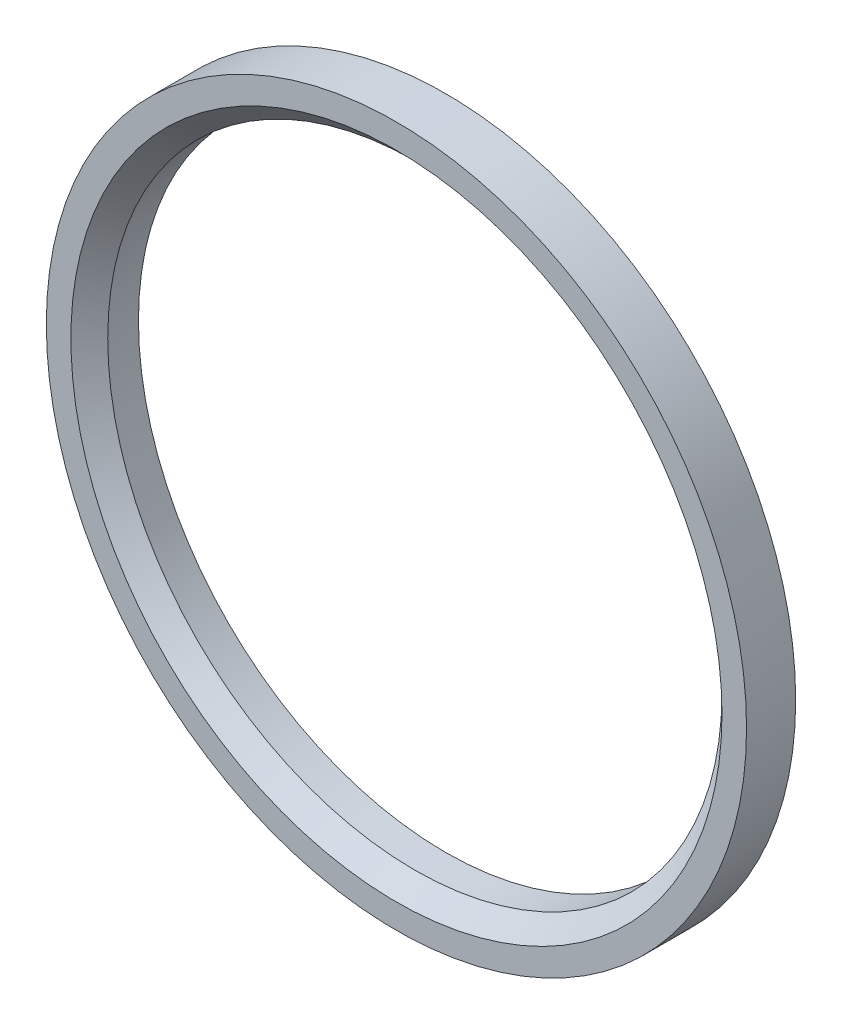
ISO-10303-21;
HEADER;
FILE_DESCRIPTION(('STEP AP214'),'2;1');
FILE_NAME('part.step','',(''),(''),'','','');
FILE_SCHEMA(('AUTOMOTIVE_DESIGN { 1 0 10303 214 1 1 1 1 }'));
ENDSEC;
DATA;
#1=APPLICATION_CONTEXT('core data for automotive mechanical design processes');
#2=APPLICATION_PROTOCOL_DEFINITION('international standard','automotive_design',2000,#1);
#3=PRODUCT_CONTEXT('',#1,'mechanical');
#4=PRODUCT('Part','Part','',(#3));
#5=PRODUCT_RELATED_PRODUCT_CATEGORY('part','',(#4));
#6=PRODUCT_DEFINITION_FORMATION('','',#4);
#7=PRODUCT_DEFINITION_CONTEXT('part definition',#1,'design');
#8=PRODUCT_DEFINITION('design','',#6,#7);
#9=PRODUCT_DEFINITION_SHAPE('','',#8);
#10=(LENGTH_UNIT() NAMED_UNIT(*) SI_UNIT(.MILLI.,.METRE.));
#11=(NAMED_UNIT(*) PLANE_ANGLE_UNIT() SI_UNIT($,.RADIAN.));
#12=(NAMED_UNIT(*) SI_UNIT($,.STERADIAN.) SOLID_ANGLE_UNIT());
#13=UNCERTAINTY_MEASURE_WITH_UNIT(LENGTH_MEASURE(1.E-05),#10,'distance_accuracy_value','');
#14=(GEOMETRIC_REPRESENTATION_CONTEXT(3) GLOBAL_UNCERTAINTY_ASSIGNED_CONTEXT((#13)) GLOBAL_UNIT_ASSIGNED_CONTEXT((#10,
#11,#12)) REPRESENTATION_CONTEXT('',''));
#15=CARTESIAN_POINT('',(0.,0.,0.));
#16=DIRECTION('',(0.,0.,1.));
#17=DIRECTION('',(1.,0.,0.));
#18=AXIS2_PLACEMENT_3D('',#15,#16,#17);
#19=CARTESIAN_POINT('',(0.,0.,2.));
#20=DIRECTION('',(0.,0.,1.));
#21=DIRECTION('',(1.,0.,0.));
#22=AXIS2_PLACEMENT_3D('',#19,#20,#21);
#23=PLANE('',#22);
#24=CARTESIAN_POINT('',(0.,0.,2.));
#25=DIRECTION('',(0.,0.,1.));
#26=DIRECTION('',(1.,0.,0.));
#27=AXIS2_PLACEMENT_3D('',#24,#25,#26);
#28=CIRCLE('',#27,26.5);
#29=CARTESIAN_POINT('',(26.5,0.,2.));
#30=VERTEX_POINT('',#29);
#31=EDGE_CURVE('E10',#30,#30,#28,.F.);
#32=ORIENTED_EDGE('',*,*,#31,.T.);
#33=EDGE_LOOP('',(#32));
#34=FACE_BOUND('',#33,.T.);
#35=CARTESIAN_POINT('',(0.,0.,2.));
#36=DIRECTION('',(0.,0.,1.));
#37=DIRECTION('',(1.,0.,0.));
#38=AXIS2_PLACEMENT_3D('',#35,#36,#37);
#39=CIRCLE('',#38,28.5);
#40=CARTESIAN_POINT('',(28.5,0.,2.));
#41=VERTEX_POINT('',#40);
#42=EDGE_CURVE('E53',#41,#41,#39,.T.);
#43=ORIENTED_EDGE('',*,*,#42,.T.);
#44=EDGE_LOOP('',(#43));
#45=FACE_BOUND('',#44,.T.);
#46=ADVANCED_FACE('F41',(#34,#45),#23,.T.);
#47=CARTESIAN_POINT('',(0.,0.,-2.));
#48=DIRECTION('',(0.,0.,1.));
#49=DIRECTION('',(1.,0.,0.));
#50=AXIS2_PLACEMENT_3D('',#47,#48,#49);
#51=PLANE('',#50);
#52=CARTESIAN_POINT('',(0.,0.,-2.));
#53=DIRECTION('',(0.,0.,1.));
#54=DIRECTION('',(1.,0.,0.));
#55=AXIS2_PLACEMENT_3D('',#52,#53,#54);
#56=CIRCLE('',#55,28.5);
#57=CARTESIAN_POINT('',(28.5,0.,-2.));
#58=VERTEX_POINT('',#57);
#59=EDGE_CURVE('E57',#58,#58,#56,.T.);
#60=ORIENTED_EDGE('',*,*,#59,.F.);
#61=EDGE_LOOP('',(#60));
#62=FACE_BOUND('',#61,.T.);
#63=CARTESIAN_POINT('',(0.,0.,-2.));
#64=DIRECTION('',(0.,0.,1.));
#65=DIRECTION('',(1.,0.,0.));
#66=AXIS2_PLACEMENT_3D('',#63,#64,#65);
#67=CIRCLE('',#66,25.);
#68=CARTESIAN_POINT('',(25.,0.,-2.));
#69=VERTEX_POINT('',#68);
#70=EDGE_CURVE('E61',#69,#69,#67,.T.);
#71=ORIENTED_EDGE('',*,*,#70,.T.);
#72=EDGE_LOOP('',(#71));
#73=FACE_BOUND('',#72,.T.);
#74=ADVANCED_FACE('F66',(#62,#73),#51,.F.);
#75=CARTESIAN_POINT('',(0.,0.,2.));
#76=DIRECTION('',(0.,0.,-1.));
#77=DIRECTION('',(-1.,0.,0.));
#78=AXIS2_PLACEMENT_3D('',#75,#76,#77);
#79=CYLINDRICAL_SURFACE('',#78,28.5);
#80=ORIENTED_EDGE('',*,*,#42,.F.);
#81=EDGE_LOOP('',(#80));
#82=FACE_BOUND('',#81,.T.);
#83=ORIENTED_EDGE('',*,*,#59,.T.);
#84=EDGE_LOOP('',(#83));
#85=FACE_BOUND('',#84,.T.);
#86=ADVANCED_FACE('F70',(#82,#85),#79,.T.);
#87=CARTESIAN_POINT('',(0.,0.,2.));
#88=DIRECTION('',(0.,0.,-1.));
#89=DIRECTION('',(-1.,0.,0.));
#90=AXIS2_PLACEMENT_3D('',#87,#88,#89);
#91=CYLINDRICAL_SURFACE('',#90,25.);
#92=CARTESIAN_POINT('',(0.,0.,0.499999999999981));
#93=DIRECTION('',(0.,0.,1.));
#94=DIRECTION('',(1.,0.,0.));
#95=AXIS2_PLACEMENT_3D('',#92,#93,#94);
#96=CIRCLE('',#95,25.);
#97=CARTESIAN_POINT('',(25.,0.,0.499999999999981));
#98=VERTEX_POINT('',#97);
#99=EDGE_CURVE('E49',#98,#98,#96,.T.);
#100=ORIENTED_EDGE('',*,*,#99,.T.);
#101=EDGE_LOOP('',(#100));
#102=FACE_BOUND('',#101,.T.);
#103=ORIENTED_EDGE('',*,*,#70,.F.);
#104=EDGE_LOOP('',(#103));
#105=FACE_BOUND('',#104,.T.);
#106=ADVANCED_FACE('F68',(#102,#105),#91,.F.);
#107=CARTESIAN_POINT('',(0.,0.,0.499999999999981));
#108=DIRECTION('',(0.,0.,1.));
#109=DIRECTION('',(1.,0.,0.));
#110=AXIS2_PLACEMENT_3D('',#107,#108,#109);
#111=CONICAL_SURFACE('',#110,25.,0.785398163397447);
#112=ORIENTED_EDGE('',*,*,#31,.F.);
#113=EDGE_LOOP('',(#112));
#114=FACE_BOUND('',#113,.T.);
#115=ORIENTED_EDGE('',*,*,#99,.F.);
#116=EDGE_LOOP('',(#115));
#117=FACE_BOUND('',#116,.T.);
#118=ADVANCED_FACE('F44',(#114,#117),#111,.F.);
#119=CLOSED_SHELL('',(#46,#74,#86,#106,#118));
#120=MANIFOLD_SOLID_BREP('B2',#119);
#121=ADVANCED_BREP_SHAPE_REPRESENTATION('',(#18,#120),#14);
#122=SHAPE_DEFINITION_REPRESENTATION(#9,#121);
ENDSEC;
END-ISO-10303-21;
